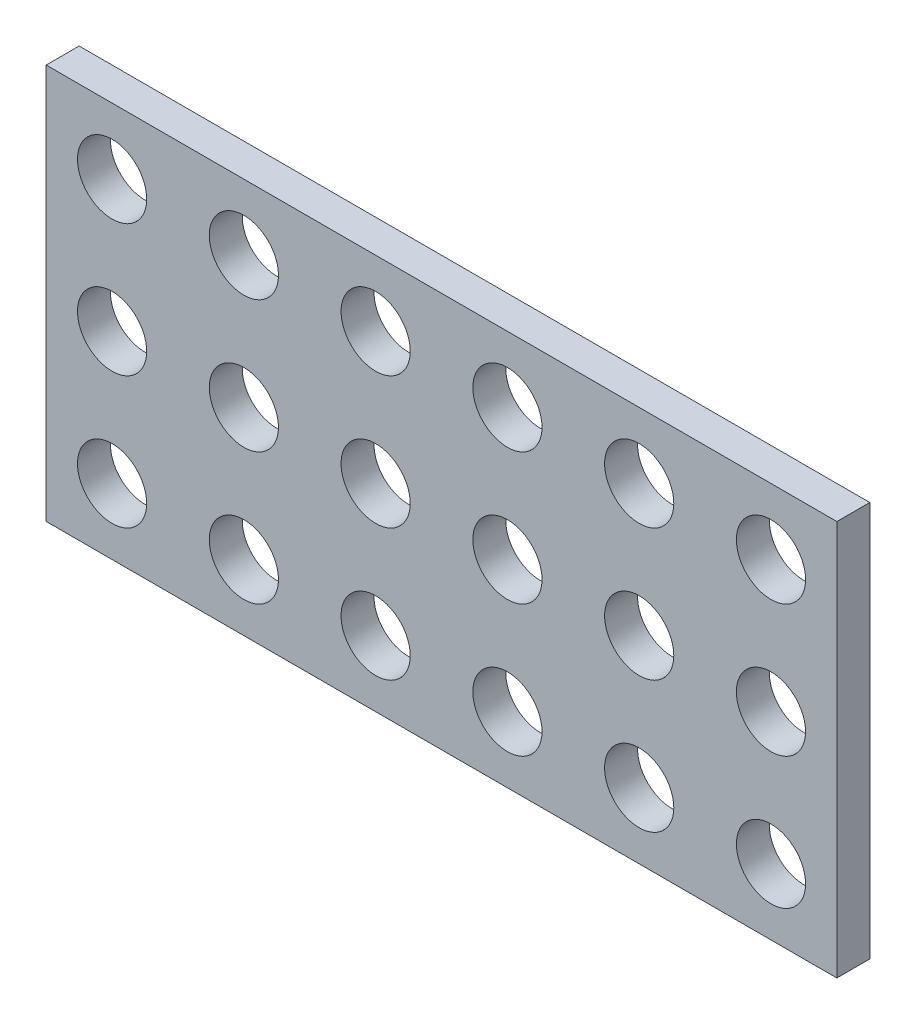
ISO-10303-21;
HEADER;
FILE_DESCRIPTION(('STEP AP214'),'2;1');
FILE_NAME('part.step','',(''),(''),'','','');
FILE_SCHEMA(('AUTOMOTIVE_DESIGN { 1 0 10303 214 1 1 1 1 }'));
ENDSEC;
DATA;
#1=APPLICATION_CONTEXT('core data for automotive mechanical design processes');
#2=APPLICATION_PROTOCOL_DEFINITION('international standard','automotive_design',2000,#1);
#3=PRODUCT_CONTEXT('',#1,'mechanical');
#4=PRODUCT('Part','Part','',(#3));
#5=PRODUCT_RELATED_PRODUCT_CATEGORY('part','',(#4));
#6=PRODUCT_DEFINITION_FORMATION('','',#4);
#7=PRODUCT_DEFINITION_CONTEXT('part definition',#1,'design');
#8=PRODUCT_DEFINITION('design','',#6,#7);
#9=PRODUCT_DEFINITION_SHAPE('','',#8);
#10=(LENGTH_UNIT() NAMED_UNIT(*) SI_UNIT(.MILLI.,.METRE.));
#11=(NAMED_UNIT(*) PLANE_ANGLE_UNIT() SI_UNIT($,.RADIAN.));
#12=(NAMED_UNIT(*) SI_UNIT($,.STERADIAN.) SOLID_ANGLE_UNIT());
#13=UNCERTAINTY_MEASURE_WITH_UNIT(LENGTH_MEASURE(1.E-05),#10,'distance_accuracy_value','');
#14=(GEOMETRIC_REPRESENTATION_CONTEXT(3) GLOBAL_UNCERTAINTY_ASSIGNED_CONTEXT((#13)) GLOBAL_UNIT_ASSIGNED_CONTEXT((#10,
#11,#12)) REPRESENTATION_CONTEXT('',''));
#15=CARTESIAN_POINT('',(0.,0.,0.));
#16=DIRECTION('',(0.,0.,1.));
#17=DIRECTION('',(1.,0.,0.));
#18=AXIS2_PLACEMENT_3D('',#15,#16,#17);
#19=CARTESIAN_POINT('',(0.,24.,2.));
#20=DIRECTION('',(1.,0.,0.));
#21=DIRECTION('',(0.,0.,-1.));
#22=AXIS2_PLACEMENT_3D('',#19,#20,#21);
#23=PLANE('',#22);
#24=DIRECTION('',(0.,-1.,0.));
#25=VECTOR('',#24,1.);
#26=CARTESIAN_POINT('',(0.,24.,0.));
#27=LINE('',#26,#25);
#28=CARTESIAN_POINT('',(0.,24.,0.));
#29=VERTEX_POINT('',#28);
#30=CARTESIAN_POINT('',(0.,0.,0.));
#31=VERTEX_POINT('',#30);
#32=EDGE_CURVE('E102',#29,#31,#27,.T.);
#33=ORIENTED_EDGE('',*,*,#32,.T.);
#34=DIRECTION('',(0.,0.,-1.));
#35=VECTOR('',#34,1.);
#36=CARTESIAN_POINT('',(0.,0.,2.));
#37=LINE('',#36,#35);
#38=CARTESIAN_POINT('',(0.,0.,2.));
#39=VERTEX_POINT('',#38);
#40=EDGE_CURVE('E93',#39,#31,#37,.T.);
#41=ORIENTED_EDGE('',*,*,#40,.F.);
#42=DIRECTION('',(0.,-1.,0.));
#43=VECTOR('',#42,1.);
#44=CARTESIAN_POINT('',(0.,24.,2.));
#45=LINE('',#44,#43);
#46=CARTESIAN_POINT('',(0.,24.,2.));
#47=VERTEX_POINT('',#46);
#48=EDGE_CURVE('E87',#47,#39,#45,.T.);
#49=ORIENTED_EDGE('',*,*,#48,.F.);
#50=DIRECTION('',(0.,0.,-1.));
#51=VECTOR('',#50,1.);
#52=CARTESIAN_POINT('',(0.,24.,2.));
#53=LINE('',#52,#51);
#54=EDGE_CURVE('E98',#47,#29,#53,.T.);
#55=ORIENTED_EDGE('',*,*,#54,.T.);
#56=EDGE_LOOP('',(#33,#41,#49,#55));
#57=FACE_BOUND('',#56,.T.);
#58=ADVANCED_FACE('F33',(#57),#23,.F.);
#59=CARTESIAN_POINT('',(0.,0.,2.));
#60=DIRECTION('',(0.,1.,0.));
#61=DIRECTION('',(0.,0.,1.));
#62=AXIS2_PLACEMENT_3D('',#59,#60,#61);
#63=PLANE('',#62);
#64=DIRECTION('',(1.,0.,0.));
#65=VECTOR('',#64,1.);
#66=CARTESIAN_POINT('',(0.,0.,0.));
#67=LINE('',#66,#65);
#68=CARTESIAN_POINT('',(48.,0.,0.));
#69=VERTEX_POINT('',#68);
#70=EDGE_CURVE('E92',#31,#69,#67,.T.);
#71=ORIENTED_EDGE('',*,*,#70,.T.);
#72=DIRECTION('',(0.,0.,-1.));
#73=VECTOR('',#72,1.);
#74=CARTESIAN_POINT('',(48.,0.,2.));
#75=LINE('',#74,#73);
#76=CARTESIAN_POINT('',(48.,0.,2.));
#77=VERTEX_POINT('',#76);
#78=EDGE_CURVE('E90',#77,#69,#75,.T.);
#79=ORIENTED_EDGE('',*,*,#78,.F.);
#80=DIRECTION('',(1.,0.,0.));
#81=VECTOR('',#80,1.);
#82=CARTESIAN_POINT('',(0.,0.,2.));
#83=LINE('',#82,#81);
#84=EDGE_CURVE('E81',#39,#77,#83,.T.);
#85=ORIENTED_EDGE('',*,*,#84,.F.);
#86=ORIENTED_EDGE('',*,*,#40,.T.);
#87=EDGE_LOOP('',(#71,#79,#85,#86));
#88=FACE_BOUND('',#87,.T.);
#89=ADVANCED_FACE('F91',(#88),#63,.F.);
#90=CARTESIAN_POINT('',(48.,24.,2.));
#91=DIRECTION('',(-1.,0.,0.));
#92=DIRECTION('',(0.,-1.,0.));
#93=AXIS2_PLACEMENT_3D('',#90,#91,#92);
#94=PLANE('',#93);
#95=DIRECTION('',(0.,1.,0.));
#96=VECTOR('',#95,1.);
#97=CARTESIAN_POINT('',(48.,24.,0.));
#98=LINE('',#97,#96);
#99=CARTESIAN_POINT('',(48.,24.,0.));
#100=VERTEX_POINT('',#99);
#101=EDGE_CURVE('E67',#69,#100,#98,.T.);
#102=ORIENTED_EDGE('',*,*,#101,.T.);
#103=DIRECTION('',(0.,0.,-1.));
#104=VECTOR('',#103,1.);
#105=CARTESIAN_POINT('',(48.,24.,2.));
#106=LINE('',#105,#104);
#107=CARTESIAN_POINT('',(48.,24.,2.));
#108=VERTEX_POINT('',#107);
#109=EDGE_CURVE('E94',#108,#100,#106,.T.);
#110=ORIENTED_EDGE('',*,*,#109,.F.);
#111=DIRECTION('',(0.,1.,0.));
#112=VECTOR('',#111,1.);
#113=CARTESIAN_POINT('',(48.,24.,2.));
#114=LINE('',#113,#112);
#115=EDGE_CURVE('E85',#77,#108,#114,.T.);
#116=ORIENTED_EDGE('',*,*,#115,.F.);
#117=ORIENTED_EDGE('',*,*,#78,.T.);
#118=EDGE_LOOP('',(#102,#110,#116,#117));
#119=FACE_BOUND('',#118,.T.);
#120=ADVANCED_FACE('F96',(#119),#94,.F.);
#121=CARTESIAN_POINT('',(0.,24.,2.));
#122=DIRECTION('',(0.,-1.,0.));
#123=DIRECTION('',(0.,0.,-1.));
#124=AXIS2_PLACEMENT_3D('',#121,#122,#123);
#125=PLANE('',#124);
#126=DIRECTION('',(-1.,0.,0.));
#127=VECTOR('',#126,1.);
#128=CARTESIAN_POINT('',(0.,24.,0.));
#129=LINE('',#128,#127);
#130=EDGE_CURVE('E73',#100,#29,#129,.T.);
#131=ORIENTED_EDGE('',*,*,#130,.T.);
#132=ORIENTED_EDGE('',*,*,#54,.F.);
#133=DIRECTION('',(-1.,0.,0.));
#134=VECTOR('',#133,1.);
#135=CARTESIAN_POINT('',(0.,24.,2.));
#136=LINE('',#135,#134);
#137=EDGE_CURVE('E50',#108,#47,#136,.T.);
#138=ORIENTED_EDGE('',*,*,#137,.F.);
#139=ORIENTED_EDGE('',*,*,#109,.T.);
#140=EDGE_LOOP('',(#131,#132,#138,#139));
#141=FACE_BOUND('',#140,.T.);
#142=ADVANCED_FACE('F212',(#141),#125,.F.);
#143=CARTESIAN_POINT('',(0.,0.,2.));
#144=DIRECTION('',(0.,0.,1.));
#145=DIRECTION('',(1.,0.,0.));
#146=AXIS2_PLACEMENT_3D('',#143,#144,#145);
#147=PLANE('',#146);
#148=CARTESIAN_POINT('',(4.,12.,2.));
#149=DIRECTION('',(0.,0.,1.));
#150=DIRECTION('',(1.,0.,0.));
#151=AXIS2_PLACEMENT_3D('',#148,#149,#150);
#152=CIRCLE('',#151,2.1);
#153=CARTESIAN_POINT('',(6.1,12.,2.));
#154=VERTEX_POINT('',#153);
#155=EDGE_CURVE('E450',#154,#154,#152,.T.);
#156=ORIENTED_EDGE('',*,*,#155,.F.);
#157=EDGE_LOOP('',(#156));
#158=FACE_BOUND('',#157,.T.);
#159=CARTESIAN_POINT('',(4.,20.,2.));
#160=DIRECTION('',(0.,0.,1.));
#161=DIRECTION('',(1.,0.,0.));
#162=AXIS2_PLACEMENT_3D('',#159,#160,#161);
#163=CIRCLE('',#162,2.1);
#164=CARTESIAN_POINT('',(6.1,20.,2.));
#165=VERTEX_POINT('',#164);
#166=EDGE_CURVE('E449',#165,#165,#163,.T.);
#167=ORIENTED_EDGE('',*,*,#166,.F.);
#168=EDGE_LOOP('',(#167));
#169=FACE_BOUND('',#168,.T.);
#170=ORIENTED_EDGE('',*,*,#48,.T.);
#171=ORIENTED_EDGE('',*,*,#84,.T.);
#172=ORIENTED_EDGE('',*,*,#115,.T.);
#173=ORIENTED_EDGE('',*,*,#137,.T.);
#174=EDGE_LOOP('',(#170,#171,#172,#173));
#175=FACE_BOUND('',#174,.T.);
#176=CARTESIAN_POINT('',(4.,4.,2.));
#177=DIRECTION('',(0.,0.,1.));
#178=DIRECTION('',(1.,0.,0.));
#179=AXIS2_PLACEMENT_3D('',#176,#177,#178);
#180=CIRCLE('',#179,2.1);
#181=CARTESIAN_POINT('',(6.1,4.,2.));
#182=VERTEX_POINT('',#181);
#183=EDGE_CURVE('E115',#182,#182,#180,.T.);
#184=ORIENTED_EDGE('',*,*,#183,.F.);
#185=EDGE_LOOP('',(#184));
#186=FACE_BOUND('',#185,.T.);
#187=CARTESIAN_POINT('',(12.,20.,2.));
#188=DIRECTION('',(0.,0.,1.));
#189=DIRECTION('',(1.,0.,0.));
#190=AXIS2_PLACEMENT_3D('',#187,#188,#189);
#191=CIRCLE('',#190,2.1);
#192=CARTESIAN_POINT('',(14.1,20.,2.));
#193=VERTEX_POINT('',#192);
#194=EDGE_CURVE('E121',#193,#193,#191,.T.);
#195=ORIENTED_EDGE('',*,*,#194,.F.);
#196=EDGE_LOOP('',(#195));
#197=FACE_BOUND('',#196,.T.);
#198=CARTESIAN_POINT('',(12.,12.,2.));
#199=DIRECTION('',(0.,0.,1.));
#200=DIRECTION('',(1.,0.,0.));
#201=AXIS2_PLACEMENT_3D('',#198,#199,#200);
#202=CIRCLE('',#201,2.1);
#203=CARTESIAN_POINT('',(14.1,12.,2.));
#204=VERTEX_POINT('',#203);
#205=EDGE_CURVE('E127',#204,#204,#202,.T.);
#206=ORIENTED_EDGE('',*,*,#205,.F.);
#207=EDGE_LOOP('',(#206));
#208=FACE_BOUND('',#207,.T.);
#209=CARTESIAN_POINT('',(12.,4.,2.));
#210=DIRECTION('',(0.,0.,1.));
#211=DIRECTION('',(1.,0.,0.));
#212=AXIS2_PLACEMENT_3D('',#209,#210,#211);
#213=CIRCLE('',#212,2.1);
#214=CARTESIAN_POINT('',(14.1,4.,2.));
#215=VERTEX_POINT('',#214);
#216=EDGE_CURVE('E133',#215,#215,#213,.T.);
#217=ORIENTED_EDGE('',*,*,#216,.F.);
#218=EDGE_LOOP('',(#217));
#219=FACE_BOUND('',#218,.T.);
#220=CARTESIAN_POINT('',(20.,20.,2.));
#221=DIRECTION('',(0.,0.,1.));
#222=DIRECTION('',(1.,0.,0.));
#223=AXIS2_PLACEMENT_3D('',#220,#221,#222);
#224=CIRCLE('',#223,2.1);
#225=CARTESIAN_POINT('',(22.1,20.,2.));
#226=VERTEX_POINT('',#225);
#227=EDGE_CURVE('E139',#226,#226,#224,.T.);
#228=ORIENTED_EDGE('',*,*,#227,.F.);
#229=EDGE_LOOP('',(#228));
#230=FACE_BOUND('',#229,.T.);
#231=CARTESIAN_POINT('',(20.,12.,2.));
#232=DIRECTION('',(0.,0.,1.));
#233=DIRECTION('',(1.,0.,0.));
#234=AXIS2_PLACEMENT_3D('',#231,#232,#233);
#235=CIRCLE('',#234,2.1);
#236=CARTESIAN_POINT('',(22.1,12.,2.));
#237=VERTEX_POINT('',#236);
#238=EDGE_CURVE('E145',#237,#237,#235,.T.);
#239=ORIENTED_EDGE('',*,*,#238,.F.);
#240=EDGE_LOOP('',(#239));
#241=FACE_BOUND('',#240,.T.);
#242=CARTESIAN_POINT('',(20.,4.,2.));
#243=DIRECTION('',(0.,0.,1.));
#244=DIRECTION('',(1.,0.,0.));
#245=AXIS2_PLACEMENT_3D('',#242,#243,#244);
#246=CIRCLE('',#245,2.1);
#247=CARTESIAN_POINT('',(22.1,4.,2.));
#248=VERTEX_POINT('',#247);
#249=EDGE_CURVE('E151',#248,#248,#246,.T.);
#250=ORIENTED_EDGE('',*,*,#249,.F.);
#251=EDGE_LOOP('',(#250));
#252=FACE_BOUND('',#251,.T.);
#253=CARTESIAN_POINT('',(28.,20.,2.));
#254=DIRECTION('',(0.,0.,1.));
#255=DIRECTION('',(1.,0.,0.));
#256=AXIS2_PLACEMENT_3D('',#253,#254,#255);
#257=CIRCLE('',#256,2.1);
#258=CARTESIAN_POINT('',(30.1,20.,2.));
#259=VERTEX_POINT('',#258);
#260=EDGE_CURVE('E157',#259,#259,#257,.T.);
#261=ORIENTED_EDGE('',*,*,#260,.F.);
#262=EDGE_LOOP('',(#261));
#263=FACE_BOUND('',#262,.T.);
#264=CARTESIAN_POINT('',(28.,12.,2.));
#265=DIRECTION('',(0.,0.,1.));
#266=DIRECTION('',(1.,0.,0.));
#267=AXIS2_PLACEMENT_3D('',#264,#265,#266);
#268=CIRCLE('',#267,2.1);
#269=CARTESIAN_POINT('',(30.1,12.,2.));
#270=VERTEX_POINT('',#269);
#271=EDGE_CURVE('E163',#270,#270,#268,.T.);
#272=ORIENTED_EDGE('',*,*,#271,.F.);
#273=EDGE_LOOP('',(#272));
#274=FACE_BOUND('',#273,.T.);
#275=CARTESIAN_POINT('',(28.,4.,2.));
#276=DIRECTION('',(0.,0.,1.));
#277=DIRECTION('',(1.,0.,0.));
#278=AXIS2_PLACEMENT_3D('',#275,#276,#277);
#279=CIRCLE('',#278,2.1);
#280=CARTESIAN_POINT('',(30.1,4.,2.));
#281=VERTEX_POINT('',#280);
#282=EDGE_CURVE('E169',#281,#281,#279,.T.);
#283=ORIENTED_EDGE('',*,*,#282,.F.);
#284=EDGE_LOOP('',(#283));
#285=FACE_BOUND('',#284,.T.);
#286=CARTESIAN_POINT('',(36.,20.,2.));
#287=DIRECTION('',(0.,0.,1.));
#288=DIRECTION('',(1.,0.,0.));
#289=AXIS2_PLACEMENT_3D('',#286,#287,#288);
#290=CIRCLE('',#289,2.1);
#291=CARTESIAN_POINT('',(38.1,20.,2.));
#292=VERTEX_POINT('',#291);
#293=EDGE_CURVE('E175',#292,#292,#290,.T.);
#294=ORIENTED_EDGE('',*,*,#293,.F.);
#295=EDGE_LOOP('',(#294));
#296=FACE_BOUND('',#295,.T.);
#297=CARTESIAN_POINT('',(36.,12.,2.));
#298=DIRECTION('',(0.,0.,1.));
#299=DIRECTION('',(1.,0.,0.));
#300=AXIS2_PLACEMENT_3D('',#297,#298,#299);
#301=CIRCLE('',#300,2.1);
#302=CARTESIAN_POINT('',(38.1,12.,2.));
#303=VERTEX_POINT('',#302);
#304=EDGE_CURVE('E181',#303,#303,#301,.T.);
#305=ORIENTED_EDGE('',*,*,#304,.F.);
#306=EDGE_LOOP('',(#305));
#307=FACE_BOUND('',#306,.T.);
#308=CARTESIAN_POINT('',(36.,4.,2.));
#309=DIRECTION('',(0.,0.,1.));
#310=DIRECTION('',(1.,0.,0.));
#311=AXIS2_PLACEMENT_3D('',#308,#309,#310);
#312=CIRCLE('',#311,2.1);
#313=CARTESIAN_POINT('',(38.1,4.,2.));
#314=VERTEX_POINT('',#313);
#315=EDGE_CURVE('E187',#314,#314,#312,.T.);
#316=ORIENTED_EDGE('',*,*,#315,.F.);
#317=EDGE_LOOP('',(#316));
#318=FACE_BOUND('',#317,.T.);
#319=CARTESIAN_POINT('',(44.,20.,2.));
#320=DIRECTION('',(0.,0.,1.));
#321=DIRECTION('',(1.,0.,0.));
#322=AXIS2_PLACEMENT_3D('',#319,#320,#321);
#323=CIRCLE('',#322,2.1);
#324=CARTESIAN_POINT('',(46.1,20.,2.));
#325=VERTEX_POINT('',#324);
#326=EDGE_CURVE('E193',#325,#325,#323,.T.);
#327=ORIENTED_EDGE('',*,*,#326,.F.);
#328=EDGE_LOOP('',(#327));
#329=FACE_BOUND('',#328,.T.);
#330=CARTESIAN_POINT('',(44.,12.,2.));
#331=DIRECTION('',(0.,0.,1.));
#332=DIRECTION('',(1.,0.,0.));
#333=AXIS2_PLACEMENT_3D('',#330,#331,#332);
#334=CIRCLE('',#333,2.1);
#335=CARTESIAN_POINT('',(46.1,12.,2.));
#336=VERTEX_POINT('',#335);
#337=EDGE_CURVE('E199',#336,#336,#334,.T.);
#338=ORIENTED_EDGE('',*,*,#337,.F.);
#339=EDGE_LOOP('',(#338));
#340=FACE_BOUND('',#339,.T.);
#341=CARTESIAN_POINT('',(44.,4.,2.));
#342=DIRECTION('',(0.,0.,1.));
#343=DIRECTION('',(1.,0.,0.));
#344=AXIS2_PLACEMENT_3D('',#341,#342,#343);
#345=CIRCLE('',#344,2.1);
#346=CARTESIAN_POINT('',(46.1,4.,2.));
#347=VERTEX_POINT('',#346);
#348=EDGE_CURVE('E11',#347,#347,#345,.T.);
#349=ORIENTED_EDGE('',*,*,#348,.F.);
#350=EDGE_LOOP('',(#349));
#351=FACE_BOUND('',#350,.T.);
#352=ADVANCED_FACE('F82',(#158,#169,#175,#186,#197,#208,#219,#230,#241,#252,#263,#274,#285,#296,
#307,#318,#329,#340,#351),#147,.T.);
#353=CARTESIAN_POINT('',(0.,0.,0.));
#354=DIRECTION('',(0.,0.,1.));
#355=DIRECTION('',(1.,0.,0.));
#356=AXIS2_PLACEMENT_3D('',#353,#354,#355);
#357=PLANE('',#356);
#358=CARTESIAN_POINT('',(4.,12.,0.));
#359=DIRECTION('',(0.,0.,1.));
#360=DIRECTION('',(1.,0.,0.));
#361=AXIS2_PLACEMENT_3D('',#358,#359,#360);
#362=CIRCLE('',#361,2.1);
#363=CARTESIAN_POINT('',(6.1,12.,0.));
#364=VERTEX_POINT('',#363);
#365=EDGE_CURVE('E454',#364,#364,#362,.T.);
#366=ORIENTED_EDGE('',*,*,#365,.T.);
#367=EDGE_LOOP('',(#366));
#368=FACE_BOUND('',#367,.T.);
#369=CARTESIAN_POINT('',(4.,20.,0.));
#370=DIRECTION('',(0.,0.,1.));
#371=DIRECTION('',(1.,0.,0.));
#372=AXIS2_PLACEMENT_3D('',#369,#370,#371);
#373=CIRCLE('',#372,2.1);
#374=CARTESIAN_POINT('',(6.1,20.,0.));
#375=VERTEX_POINT('',#374);
#376=EDGE_CURVE('E105',#375,#375,#373,.T.);
#377=ORIENTED_EDGE('',*,*,#376,.T.);
#378=EDGE_LOOP('',(#377));
#379=FACE_BOUND('',#378,.T.);
#380=ORIENTED_EDGE('',*,*,#32,.F.);
#381=ORIENTED_EDGE('',*,*,#130,.F.);
#382=ORIENTED_EDGE('',*,*,#101,.F.);
#383=ORIENTED_EDGE('',*,*,#70,.F.);
#384=EDGE_LOOP('',(#380,#381,#382,#383));
#385=FACE_BOUND('',#384,.T.);
#386=CARTESIAN_POINT('',(4.,4.,0.));
#387=DIRECTION('',(0.,0.,1.));
#388=DIRECTION('',(1.,0.,0.));
#389=AXIS2_PLACEMENT_3D('',#386,#387,#388);
#390=CIRCLE('',#389,2.1);
#391=CARTESIAN_POINT('',(6.1,4.,0.));
#392=VERTEX_POINT('',#391);
#393=EDGE_CURVE('E112',#392,#392,#390,.T.);
#394=ORIENTED_EDGE('',*,*,#393,.T.);
#395=EDGE_LOOP('',(#394));
#396=FACE_BOUND('',#395,.T.);
#397=CARTESIAN_POINT('',(12.,20.,0.));
#398=DIRECTION('',(0.,0.,1.));
#399=DIRECTION('',(1.,0.,0.));
#400=AXIS2_PLACEMENT_3D('',#397,#398,#399);
#401=CIRCLE('',#400,2.1);
#402=CARTESIAN_POINT('',(14.1,20.,0.));
#403=VERTEX_POINT('',#402);
#404=EDGE_CURVE('E118',#403,#403,#401,.T.);
#405=ORIENTED_EDGE('',*,*,#404,.T.);
#406=EDGE_LOOP('',(#405));
#407=FACE_BOUND('',#406,.T.);
#408=CARTESIAN_POINT('',(12.,12.,0.));
#409=DIRECTION('',(0.,0.,1.));
#410=DIRECTION('',(1.,0.,0.));
#411=AXIS2_PLACEMENT_3D('',#408,#409,#410);
#412=CIRCLE('',#411,2.1);
#413=CARTESIAN_POINT('',(14.1,12.,0.));
#414=VERTEX_POINT('',#413);
#415=EDGE_CURVE('E124',#414,#414,#412,.T.);
#416=ORIENTED_EDGE('',*,*,#415,.T.);
#417=EDGE_LOOP('',(#416));
#418=FACE_BOUND('',#417,.T.);
#419=CARTESIAN_POINT('',(12.,4.,0.));
#420=DIRECTION('',(0.,0.,1.));
#421=DIRECTION('',(1.,0.,0.));
#422=AXIS2_PLACEMENT_3D('',#419,#420,#421);
#423=CIRCLE('',#422,2.1);
#424=CARTESIAN_POINT('',(14.1,4.,0.));
#425=VERTEX_POINT('',#424);
#426=EDGE_CURVE('E130',#425,#425,#423,.T.);
#427=ORIENTED_EDGE('',*,*,#426,.T.);
#428=EDGE_LOOP('',(#427));
#429=FACE_BOUND('',#428,.T.);
#430=CARTESIAN_POINT('',(20.,20.,0.));
#431=DIRECTION('',(0.,0.,1.));
#432=DIRECTION('',(1.,0.,0.));
#433=AXIS2_PLACEMENT_3D('',#430,#431,#432);
#434=CIRCLE('',#433,2.1);
#435=CARTESIAN_POINT('',(22.1,20.,0.));
#436=VERTEX_POINT('',#435);
#437=EDGE_CURVE('E136',#436,#436,#434,.T.);
#438=ORIENTED_EDGE('',*,*,#437,.T.);
#439=EDGE_LOOP('',(#438));
#440=FACE_BOUND('',#439,.T.);
#441=CARTESIAN_POINT('',(20.,12.,0.));
#442=DIRECTION('',(0.,0.,1.));
#443=DIRECTION('',(1.,0.,0.));
#444=AXIS2_PLACEMENT_3D('',#441,#442,#443);
#445=CIRCLE('',#444,2.1);
#446=CARTESIAN_POINT('',(22.1,12.,0.));
#447=VERTEX_POINT('',#446);
#448=EDGE_CURVE('E142',#447,#447,#445,.T.);
#449=ORIENTED_EDGE('',*,*,#448,.T.);
#450=EDGE_LOOP('',(#449));
#451=FACE_BOUND('',#450,.T.);
#452=CARTESIAN_POINT('',(20.,4.,0.));
#453=DIRECTION('',(0.,0.,1.));
#454=DIRECTION('',(1.,0.,0.));
#455=AXIS2_PLACEMENT_3D('',#452,#453,#454);
#456=CIRCLE('',#455,2.1);
#457=CARTESIAN_POINT('',(22.1,4.,0.));
#458=VERTEX_POINT('',#457);
#459=EDGE_CURVE('E148',#458,#458,#456,.T.);
#460=ORIENTED_EDGE('',*,*,#459,.T.);
#461=EDGE_LOOP('',(#460));
#462=FACE_BOUND('',#461,.T.);
#463=CARTESIAN_POINT('',(28.,20.,0.));
#464=DIRECTION('',(0.,0.,1.));
#465=DIRECTION('',(1.,0.,0.));
#466=AXIS2_PLACEMENT_3D('',#463,#464,#465);
#467=CIRCLE('',#466,2.1);
#468=CARTESIAN_POINT('',(30.1,20.,0.));
#469=VERTEX_POINT('',#468);
#470=EDGE_CURVE('E154',#469,#469,#467,.T.);
#471=ORIENTED_EDGE('',*,*,#470,.T.);
#472=EDGE_LOOP('',(#471));
#473=FACE_BOUND('',#472,.T.);
#474=CARTESIAN_POINT('',(28.,12.,0.));
#475=DIRECTION('',(0.,0.,1.));
#476=DIRECTION('',(1.,0.,0.));
#477=AXIS2_PLACEMENT_3D('',#474,#475,#476);
#478=CIRCLE('',#477,2.1);
#479=CARTESIAN_POINT('',(30.1,12.,0.));
#480=VERTEX_POINT('',#479);
#481=EDGE_CURVE('E160',#480,#480,#478,.T.);
#482=ORIENTED_EDGE('',*,*,#481,.T.);
#483=EDGE_LOOP('',(#482));
#484=FACE_BOUND('',#483,.T.);
#485=CARTESIAN_POINT('',(28.,4.,0.));
#486=DIRECTION('',(0.,0.,1.));
#487=DIRECTION('',(1.,0.,0.));
#488=AXIS2_PLACEMENT_3D('',#485,#486,#487);
#489=CIRCLE('',#488,2.1);
#490=CARTESIAN_POINT('',(30.1,4.,0.));
#491=VERTEX_POINT('',#490);
#492=EDGE_CURVE('E166',#491,#491,#489,.T.);
#493=ORIENTED_EDGE('',*,*,#492,.T.);
#494=EDGE_LOOP('',(#493));
#495=FACE_BOUND('',#494,.T.);
#496=CARTESIAN_POINT('',(36.,20.,0.));
#497=DIRECTION('',(0.,0.,1.));
#498=DIRECTION('',(1.,0.,0.));
#499=AXIS2_PLACEMENT_3D('',#496,#497,#498);
#500=CIRCLE('',#499,2.1);
#501=CARTESIAN_POINT('',(38.1,20.,0.));
#502=VERTEX_POINT('',#501);
#503=EDGE_CURVE('E172',#502,#502,#500,.T.);
#504=ORIENTED_EDGE('',*,*,#503,.T.);
#505=EDGE_LOOP('',(#504));
#506=FACE_BOUND('',#505,.T.);
#507=CARTESIAN_POINT('',(36.,12.,0.));
#508=DIRECTION('',(0.,0.,1.));
#509=DIRECTION('',(1.,0.,0.));
#510=AXIS2_PLACEMENT_3D('',#507,#508,#509);
#511=CIRCLE('',#510,2.1);
#512=CARTESIAN_POINT('',(38.1,12.,0.));
#513=VERTEX_POINT('',#512);
#514=EDGE_CURVE('E178',#513,#513,#511,.T.);
#515=ORIENTED_EDGE('',*,*,#514,.T.);
#516=EDGE_LOOP('',(#515));
#517=FACE_BOUND('',#516,.T.);
#518=CARTESIAN_POINT('',(36.,4.,0.));
#519=DIRECTION('',(0.,0.,1.));
#520=DIRECTION('',(1.,0.,0.));
#521=AXIS2_PLACEMENT_3D('',#518,#519,#520);
#522=CIRCLE('',#521,2.1);
#523=CARTESIAN_POINT('',(38.1,4.,0.));
#524=VERTEX_POINT('',#523);
#525=EDGE_CURVE('E184',#524,#524,#522,.T.);
#526=ORIENTED_EDGE('',*,*,#525,.T.);
#527=EDGE_LOOP('',(#526));
#528=FACE_BOUND('',#527,.T.);
#529=CARTESIAN_POINT('',(44.,20.,0.));
#530=DIRECTION('',(0.,0.,1.));
#531=DIRECTION('',(1.,0.,0.));
#532=AXIS2_PLACEMENT_3D('',#529,#530,#531);
#533=CIRCLE('',#532,2.1);
#534=CARTESIAN_POINT('',(46.1,20.,0.));
#535=VERTEX_POINT('',#534);
#536=EDGE_CURVE('E190',#535,#535,#533,.T.);
#537=ORIENTED_EDGE('',*,*,#536,.T.);
#538=EDGE_LOOP('',(#537));
#539=FACE_BOUND('',#538,.T.);
#540=CARTESIAN_POINT('',(44.,12.,0.));
#541=DIRECTION('',(0.,0.,1.));
#542=DIRECTION('',(1.,0.,0.));
#543=AXIS2_PLACEMENT_3D('',#540,#541,#542);
#544=CIRCLE('',#543,2.1);
#545=CARTESIAN_POINT('',(46.1,12.,0.));
#546=VERTEX_POINT('',#545);
#547=EDGE_CURVE('E196',#546,#546,#544,.T.);
#548=ORIENTED_EDGE('',*,*,#547,.T.);
#549=EDGE_LOOP('',(#548));
#550=FACE_BOUND('',#549,.T.);
#551=CARTESIAN_POINT('',(44.,4.,0.));
#552=DIRECTION('',(0.,0.,1.));
#553=DIRECTION('',(1.,0.,0.));
#554=AXIS2_PLACEMENT_3D('',#551,#552,#553);
#555=CIRCLE('',#554,2.1);
#556=CARTESIAN_POINT('',(46.1,4.,0.));
#557=VERTEX_POINT('',#556);
#558=EDGE_CURVE('E42',#557,#557,#555,.T.);
#559=ORIENTED_EDGE('',*,*,#558,.T.);
#560=EDGE_LOOP('',(#559));
#561=FACE_BOUND('',#560,.T.);
#562=ADVANCED_FACE('F204',(#368,#379,#385,#396,#407,#418,#429,#440,#451,#462,#473,#484,#495,
#506,#517,#528,#539,#550,#561),#357,.F.);
#563=CARTESIAN_POINT('',(4.,20.,0.));
#564=DIRECTION('',(0.,0.,1.));
#565=DIRECTION('',(1.,0.,0.));
#566=AXIS2_PLACEMENT_3D('',#563,#564,#565);
#567=CYLINDRICAL_SURFACE('',#566,2.1);
#568=ORIENTED_EDGE('',*,*,#376,.F.);
#569=EDGE_LOOP('',(#568));
#570=FACE_BOUND('',#569,.T.);
#571=ORIENTED_EDGE('',*,*,#166,.T.);
#572=EDGE_LOOP('',(#571));
#573=FACE_BOUND('',#572,.T.);
#574=ADVANCED_FACE('F219',(#570,#573),#567,.F.);
#575=CARTESIAN_POINT('',(4.,12.,0.));
#576=DIRECTION('',(0.,0.,1.));
#577=DIRECTION('',(1.,0.,0.));
#578=AXIS2_PLACEMENT_3D('',#575,#576,#577);
#579=CYLINDRICAL_SURFACE('',#578,2.1);
#580=ORIENTED_EDGE('',*,*,#365,.F.);
#581=EDGE_LOOP('',(#580));
#582=FACE_BOUND('',#581,.T.);
#583=ORIENTED_EDGE('',*,*,#155,.T.);
#584=EDGE_LOOP('',(#583));
#585=FACE_BOUND('',#584,.T.);
#586=ADVANCED_FACE('F239',(#582,#585),#579,.F.);
#587=CARTESIAN_POINT('',(4.,4.,0.));
#588=DIRECTION('',(0.,0.,1.));
#589=DIRECTION('',(1.,0.,0.));
#590=AXIS2_PLACEMENT_3D('',#587,#588,#589);
#591=CYLINDRICAL_SURFACE('',#590,2.1);
#592=ORIENTED_EDGE('',*,*,#393,.F.);
#593=EDGE_LOOP('',(#592));
#594=FACE_BOUND('',#593,.T.);
#595=ORIENTED_EDGE('',*,*,#183,.T.);
#596=EDGE_LOOP('',(#595));
#597=FACE_BOUND('',#596,.T.);
#598=ADVANCED_FACE('F235',(#594,#597),#591,.F.);
#599=CARTESIAN_POINT('',(12.,20.,0.));
#600=DIRECTION('',(0.,0.,1.));
#601=DIRECTION('',(1.,0.,0.));
#602=AXIS2_PLACEMENT_3D('',#599,#600,#601);
#603=CYLINDRICAL_SURFACE('',#602,2.1);
#604=ORIENTED_EDGE('',*,*,#404,.F.);
#605=EDGE_LOOP('',(#604));
#606=FACE_BOUND('',#605,.T.);
#607=ORIENTED_EDGE('',*,*,#194,.T.);
#608=EDGE_LOOP('',(#607));
#609=FACE_BOUND('',#608,.T.);
#610=ADVANCED_FACE('F238',(#606,#609),#603,.F.);
#611=CARTESIAN_POINT('',(12.,12.,0.));
#612=DIRECTION('',(0.,0.,1.));
#613=DIRECTION('',(1.,0.,0.));
#614=AXIS2_PLACEMENT_3D('',#611,#612,#613);
#615=CYLINDRICAL_SURFACE('',#614,2.1);
#616=ORIENTED_EDGE('',*,*,#415,.F.);
#617=EDGE_LOOP('',(#616));
#618=FACE_BOUND('',#617,.T.);
#619=ORIENTED_EDGE('',*,*,#205,.T.);
#620=EDGE_LOOP('',(#619));
#621=FACE_BOUND('',#620,.T.);
#622=ADVANCED_FACE('F243',(#618,#621),#615,.F.);
#623=CARTESIAN_POINT('',(12.,4.,0.));
#624=DIRECTION('',(0.,0.,1.));
#625=DIRECTION('',(1.,0.,0.));
#626=AXIS2_PLACEMENT_3D('',#623,#624,#625);
#627=CYLINDRICAL_SURFACE('',#626,2.1);
#628=ORIENTED_EDGE('',*,*,#426,.F.);
#629=EDGE_LOOP('',(#628));
#630=FACE_BOUND('',#629,.T.);
#631=ORIENTED_EDGE('',*,*,#216,.T.);
#632=EDGE_LOOP('',(#631));
#633=FACE_BOUND('',#632,.T.);
#634=ADVANCED_FACE('F247',(#630,#633),#627,.F.);
#635=CARTESIAN_POINT('',(20.,20.,0.));
#636=DIRECTION('',(0.,0.,1.));
#637=DIRECTION('',(1.,0.,0.));
#638=AXIS2_PLACEMENT_3D('',#635,#636,#637);
#639=CYLINDRICAL_SURFACE('',#638,2.1);
#640=ORIENTED_EDGE('',*,*,#437,.F.);
#641=EDGE_LOOP('',(#640));
#642=FACE_BOUND('',#641,.T.);
#643=ORIENTED_EDGE('',*,*,#227,.T.);
#644=EDGE_LOOP('',(#643));
#645=FACE_BOUND('',#644,.T.);
#646=ADVANCED_FACE('F251',(#642,#645),#639,.F.);
#647=CARTESIAN_POINT('',(20.,12.,0.));
#648=DIRECTION('',(0.,0.,1.));
#649=DIRECTION('',(1.,0.,0.));
#650=AXIS2_PLACEMENT_3D('',#647,#648,#649);
#651=CYLINDRICAL_SURFACE('',#650,2.1);
#652=ORIENTED_EDGE('',*,*,#448,.F.);
#653=EDGE_LOOP('',(#652));
#654=FACE_BOUND('',#653,.T.);
#655=ORIENTED_EDGE('',*,*,#238,.T.);
#656=EDGE_LOOP('',(#655));
#657=FACE_BOUND('',#656,.T.);
#658=ADVANCED_FACE('F255',(#654,#657),#651,.F.);
#659=CARTESIAN_POINT('',(20.,4.,0.));
#660=DIRECTION('',(0.,0.,1.));
#661=DIRECTION('',(1.,0.,0.));
#662=AXIS2_PLACEMENT_3D('',#659,#660,#661);
#663=CYLINDRICAL_SURFACE('',#662,2.1);
#664=ORIENTED_EDGE('',*,*,#459,.F.);
#665=EDGE_LOOP('',(#664));
#666=FACE_BOUND('',#665,.T.);
#667=ORIENTED_EDGE('',*,*,#249,.T.);
#668=EDGE_LOOP('',(#667));
#669=FACE_BOUND('',#668,.T.);
#670=ADVANCED_FACE('F259',(#666,#669),#663,.F.);
#671=CARTESIAN_POINT('',(28.,20.,0.));
#672=DIRECTION('',(0.,0.,1.));
#673=DIRECTION('',(1.,0.,0.));
#674=AXIS2_PLACEMENT_3D('',#671,#672,#673);
#675=CYLINDRICAL_SURFACE('',#674,2.1);
#676=ORIENTED_EDGE('',*,*,#470,.F.);
#677=EDGE_LOOP('',(#676));
#678=FACE_BOUND('',#677,.T.);
#679=ORIENTED_EDGE('',*,*,#260,.T.);
#680=EDGE_LOOP('',(#679));
#681=FACE_BOUND('',#680,.T.);
#682=ADVANCED_FACE('F263',(#678,#681),#675,.F.);
#683=CARTESIAN_POINT('',(28.,12.,0.));
#684=DIRECTION('',(0.,0.,1.));
#685=DIRECTION('',(1.,0.,0.));
#686=AXIS2_PLACEMENT_3D('',#683,#684,#685);
#687=CYLINDRICAL_SURFACE('',#686,2.1);
#688=ORIENTED_EDGE('',*,*,#481,.F.);
#689=EDGE_LOOP('',(#688));
#690=FACE_BOUND('',#689,.T.);
#691=ORIENTED_EDGE('',*,*,#271,.T.);
#692=EDGE_LOOP('',(#691));
#693=FACE_BOUND('',#692,.T.);
#694=ADVANCED_FACE('F267',(#690,#693),#687,.F.);
#695=CARTESIAN_POINT('',(28.,4.,0.));
#696=DIRECTION('',(0.,0.,1.));
#697=DIRECTION('',(1.,0.,0.));
#698=AXIS2_PLACEMENT_3D('',#695,#696,#697);
#699=CYLINDRICAL_SURFACE('',#698,2.1);
#700=ORIENTED_EDGE('',*,*,#492,.F.);
#701=EDGE_LOOP('',(#700));
#702=FACE_BOUND('',#701,.T.);
#703=ORIENTED_EDGE('',*,*,#282,.T.);
#704=EDGE_LOOP('',(#703));
#705=FACE_BOUND('',#704,.T.);
#706=ADVANCED_FACE('F271',(#702,#705),#699,.F.);
#707=CARTESIAN_POINT('',(36.,20.,0.));
#708=DIRECTION('',(0.,0.,1.));
#709=DIRECTION('',(1.,0.,0.));
#710=AXIS2_PLACEMENT_3D('',#707,#708,#709);
#711=CYLINDRICAL_SURFACE('',#710,2.1);
#712=ORIENTED_EDGE('',*,*,#503,.F.);
#713=EDGE_LOOP('',(#712));
#714=FACE_BOUND('',#713,.T.);
#715=ORIENTED_EDGE('',*,*,#293,.T.);
#716=EDGE_LOOP('',(#715));
#717=FACE_BOUND('',#716,.T.);
#718=ADVANCED_FACE('F275',(#714,#717),#711,.F.);
#719=CARTESIAN_POINT('',(36.,12.,0.));
#720=DIRECTION('',(0.,0.,1.));
#721=DIRECTION('',(1.,0.,0.));
#722=AXIS2_PLACEMENT_3D('',#719,#720,#721);
#723=CYLINDRICAL_SURFACE('',#722,2.1);
#724=ORIENTED_EDGE('',*,*,#514,.F.);
#725=EDGE_LOOP('',(#724));
#726=FACE_BOUND('',#725,.T.);
#727=ORIENTED_EDGE('',*,*,#304,.T.);
#728=EDGE_LOOP('',(#727));
#729=FACE_BOUND('',#728,.T.);
#730=ADVANCED_FACE('F279',(#726,#729),#723,.F.);
#731=CARTESIAN_POINT('',(36.,4.,0.));
#732=DIRECTION('',(0.,0.,1.));
#733=DIRECTION('',(1.,0.,0.));
#734=AXIS2_PLACEMENT_3D('',#731,#732,#733);
#735=CYLINDRICAL_SURFACE('',#734,2.1);
#736=ORIENTED_EDGE('',*,*,#525,.F.);
#737=EDGE_LOOP('',(#736));
#738=FACE_BOUND('',#737,.T.);
#739=ORIENTED_EDGE('',*,*,#315,.T.);
#740=EDGE_LOOP('',(#739));
#741=FACE_BOUND('',#740,.T.);
#742=ADVANCED_FACE('F283',(#738,#741),#735,.F.);
#743=CARTESIAN_POINT('',(44.,20.,0.));
#744=DIRECTION('',(0.,0.,1.));
#745=DIRECTION('',(1.,0.,0.));
#746=AXIS2_PLACEMENT_3D('',#743,#744,#745);
#747=CYLINDRICAL_SURFACE('',#746,2.1);
#748=ORIENTED_EDGE('',*,*,#536,.F.);
#749=EDGE_LOOP('',(#748));
#750=FACE_BOUND('',#749,.T.);
#751=ORIENTED_EDGE('',*,*,#326,.T.);
#752=EDGE_LOOP('',(#751));
#753=FACE_BOUND('',#752,.T.);
#754=ADVANCED_FACE('F287',(#750,#753),#747,.F.);
#755=CARTESIAN_POINT('',(44.,12.,0.));
#756=DIRECTION('',(0.,0.,1.));
#757=DIRECTION('',(1.,0.,0.));
#758=AXIS2_PLACEMENT_3D('',#755,#756,#757);
#759=CYLINDRICAL_SURFACE('',#758,2.1);
#760=ORIENTED_EDGE('',*,*,#547,.F.);
#761=EDGE_LOOP('',(#760));
#762=FACE_BOUND('',#761,.T.);
#763=ORIENTED_EDGE('',*,*,#337,.T.);
#764=EDGE_LOOP('',(#763));
#765=FACE_BOUND('',#764,.T.);
#766=ADVANCED_FACE('F208',(#762,#765),#759,.F.);
#767=CARTESIAN_POINT('',(44.,4.,0.));
#768=DIRECTION('',(0.,0.,1.));
#769=DIRECTION('',(1.,0.,0.));
#770=AXIS2_PLACEMENT_3D('',#767,#768,#769);
#771=CYLINDRICAL_SURFACE('',#770,2.1);
#772=ORIENTED_EDGE('',*,*,#558,.F.);
#773=EDGE_LOOP('',(#772));
#774=FACE_BOUND('',#773,.T.);
#775=ORIENTED_EDGE('',*,*,#348,.T.);
#776=EDGE_LOOP('',(#775));
#777=FACE_BOUND('',#776,.T.);
#778=ADVANCED_FACE('F35',(#774,#777),#771,.F.);
#779=CLOSED_SHELL('',(#58,#89,#120,#142,#352,#562,#574,#586,#598,#610,#622,#634,#646,#658,#670,
#682,#694,#706,#718,#730,#742,#754,#766,#778));
#780=MANIFOLD_SOLID_BREP('B2',#779);
#781=ADVANCED_BREP_SHAPE_REPRESENTATION('',(#18,#780),#14);
#782=SHAPE_DEFINITION_REPRESENTATION(#9,#781);
ENDSEC;
END-ISO-10303-21;
